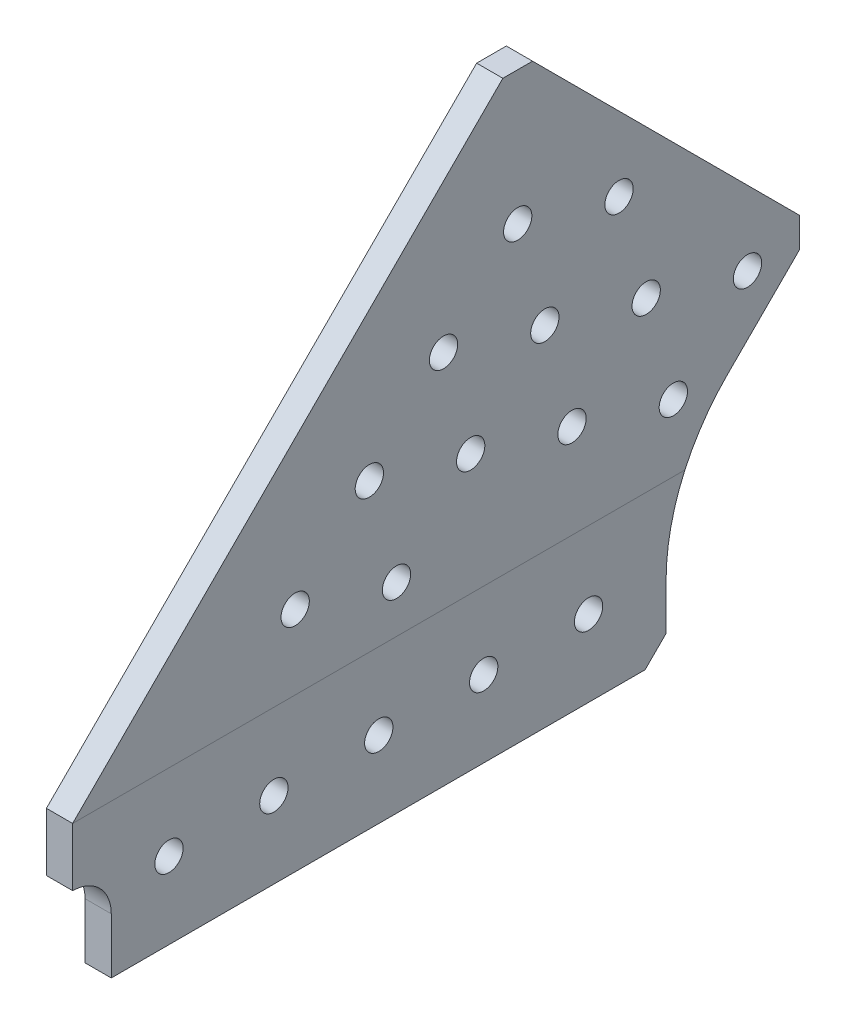
ISO-10303-21;
HEADER;
FILE_DESCRIPTION(('STEP AP214'),'2;1');
FILE_NAME('part.step','',(''),(''),'','','');
FILE_SCHEMA(('AUTOMOTIVE_DESIGN { 1 0 10303 214 1 1 1 1 }'));
ENDSEC;
DATA;
#1=APPLICATION_CONTEXT('core data for automotive mechanical design processes');
#2=APPLICATION_PROTOCOL_DEFINITION('international standard','automotive_design',2000,#1);
#3=PRODUCT_CONTEXT('',#1,'mechanical');
#4=PRODUCT('Part','Part','',(#3));
#5=PRODUCT_RELATED_PRODUCT_CATEGORY('part','',(#4));
#6=PRODUCT_DEFINITION_FORMATION('','',#4);
#7=PRODUCT_DEFINITION_CONTEXT('part definition',#1,'design');
#8=PRODUCT_DEFINITION('design','',#6,#7);
#9=PRODUCT_DEFINITION_SHAPE('','',#8);
#10=(LENGTH_UNIT() NAMED_UNIT(*) SI_UNIT(.MILLI.,.METRE.));
#11=(NAMED_UNIT(*) PLANE_ANGLE_UNIT() SI_UNIT($,.RADIAN.));
#12=(NAMED_UNIT(*) SI_UNIT($,.STERADIAN.) SOLID_ANGLE_UNIT());
#13=UNCERTAINTY_MEASURE_WITH_UNIT(LENGTH_MEASURE(1.E-05),#10,'distance_accuracy_value','');
#14=(GEOMETRIC_REPRESENTATION_CONTEXT(3) GLOBAL_UNCERTAINTY_ASSIGNED_CONTEXT((#13)) GLOBAL_UNIT_ASSIGNED_CONTEXT((#10,
#11,#12)) REPRESENTATION_CONTEXT('',''));
#15=CARTESIAN_POINT('',(0.,0.,0.));
#16=DIRECTION('',(0.,0.,1.));
#17=DIRECTION('',(1.,0.,0.));
#18=AXIS2_PLACEMENT_3D('',#15,#16,#17);
#19=CARTESIAN_POINT('',(3.175,8.02097551572331,-25.4));
#20=DIRECTION('',(1.,0.,0.));
#21=DIRECTION('',(0.,0.,-1.));
#22=AXIS2_PLACEMENT_3D('',#19,#20,#21);
#23=PLANE('',#22);
#24=CARTESIAN_POINT('',(3.175,6.73099999999865,71.9292945685666));
#25=DIRECTION('',(-1.,0.,0.));
#26=DIRECTION('',(0.,0.,1.));
#27=AXIS2_PLACEMENT_3D('',#24,#25,#26);
#28=CIRCLE('',#27,4.7625);
#29=CARTESIAN_POINT('',(3.175,11.492700794387,71.8420489685536));
#30=VERTEX_POINT('',#29);
#31=CARTESIAN_POINT('',(3.175,6.73099999999865,67.1667945685666));
#32=VERTEX_POINT('',#31);
#33=EDGE_CURVE('E173',#30,#32,#28,.T.);
#34=ORIENTED_EDGE('',*,*,#33,.T.);
#35=DIRECTION('',(0.,-1.,0.));
#36=VECTOR('',#35,1.);
#37=CARTESIAN_POINT('',(3.175,6.73099999999865,67.1667945685666));
#38=LINE('',#37,#36);
#39=CARTESIAN_POINT('',(3.175,0.,67.1667945685666));
#40=VERTEX_POINT('',#39);
#41=EDGE_CURVE('E180',#32,#40,#38,.T.);
#42=ORIENTED_EDGE('',*,*,#41,.T.);
#43=DIRECTION('',(0.,0.,-1.));
#44=VECTOR('',#43,1.);
#45=CARTESIAN_POINT('',(3.175,0.,71.8420489685536));
#46=LINE('',#45,#44);
#47=CARTESIAN_POINT('',(3.175,0.,2.54000000000003));
#48=VERTEX_POINT('',#47);
#49=EDGE_CURVE('E344',#40,#48,#46,.T.);
#50=ORIENTED_EDGE('',*,*,#49,.T.);
#51=DIRECTION('',(0.,-0.707106781186546,0.707106781186549));
#52=VECTOR('',#51,1.);
#53=CARTESIAN_POINT('',(3.175,17.9804877578616,-15.4404877578617));
#54=LINE('',#53,#52);
#55=CARTESIAN_POINT('',(3.175,2.54000000000001,0.));
#56=VERTEX_POINT('',#55);
#57=EDGE_CURVE('E419',#48,#56,#54,.F.);
#58=ORIENTED_EDGE('',*,*,#57,.T.);
#59=DIRECTION('',(0.,1.,0.));
#60=VECTOR('',#59,1.);
#61=CARTESIAN_POINT('',(3.175,0.,0.));
#62=LINE('',#61,#60);
#63=CARTESIAN_POINT('',(3.175,8.02097551572331,0.));
#64=VERTEX_POINT('',#63);
#65=EDGE_CURVE('E347',#56,#64,#62,.T.);
#66=ORIENTED_EDGE('',*,*,#65,.T.);
#67=CARTESIAN_POINT('',(3.175,8.02097551572331,-25.4));
#68=DIRECTION('',(-1.,0.,0.));
#69=DIRECTION('',(0.,0.,-1.));
#70=AXIS2_PLACEMENT_3D('',#67,#68,#69);
#71=CIRCLE('',#70,25.4);
#72=CARTESIAN_POINT('',(3.175,18.542,-2.28143508343888));
#73=VERTEX_POINT('',#72);
#74=EDGE_CURVE('E352',#64,#73,#71,.T.);
#75=ORIENTED_EDGE('',*,*,#74,.T.);
#76=DIRECTION('',(0.,0.,1.));
#77=VECTOR('',#76,1.);
#78=CARTESIAN_POINT('',(3.175,18.542,-25.4));
#79=LINE('',#78,#77);
#80=CARTESIAN_POINT('',(3.175,18.542,71.8420489685536));
#81=VERTEX_POINT('',#80);
#82=EDGE_CURVE('E402',#73,#81,#79,.T.);
#83=ORIENTED_EDGE('',*,*,#82,.T.);
#84=DIRECTION('',(0.,-1.,0.));
#85=VECTOR('',#84,1.);
#86=CARTESIAN_POINT('',(3.175,18.542,71.8420489685536));
#87=LINE('',#86,#85);
#88=EDGE_CURVE('E193',#81,#30,#87,.T.);
#89=ORIENTED_EDGE('',*,*,#88,.T.);
#90=EDGE_LOOP('',(#34,#42,#50,#58,#66,#75,#83,#89));
#91=FACE_BOUND('',#90,.T.);
#92=CARTESIAN_POINT('',(3.175,9.271,60.1803069425573));
#93=DIRECTION('',(1.,0.,0.));
#94=DIRECTION('',(0.,1.,0.));
#95=AXIS2_PLACEMENT_3D('',#92,#93,#94);
#96=CIRCLE('',#95,1.7145);
#97=CARTESIAN_POINT('',(3.175,10.9855,60.1803069425573));
#98=VERTEX_POINT('',#97);
#99=EDGE_CURVE('E309',#98,#98,#96,.T.);
#100=ORIENTED_EDGE('',*,*,#99,.F.);
#101=EDGE_LOOP('',(#100));
#102=FACE_BOUND('',#101,.T.);
#103=CARTESIAN_POINT('',(3.175,9.271,47.4803069425573));
#104=DIRECTION('',(1.,0.,0.));
#105=DIRECTION('',(0.,1.,0.));
#106=AXIS2_PLACEMENT_3D('',#103,#104,#105);
#107=CIRCLE('',#106,1.7145);
#108=CARTESIAN_POINT('',(3.175,10.9855,47.4803069425573));
#109=VERTEX_POINT('',#108);
#110=EDGE_CURVE('E317',#109,#109,#107,.T.);
#111=ORIENTED_EDGE('',*,*,#110,.F.);
#112=EDGE_LOOP('',(#111));
#113=FACE_BOUND('',#112,.T.);
#114=CARTESIAN_POINT('',(3.175,9.271,34.7803069425574));
#115=DIRECTION('',(1.,0.,0.));
#116=DIRECTION('',(0.,1.,0.));
#117=AXIS2_PLACEMENT_3D('',#114,#115,#116);
#118=CIRCLE('',#117,1.7145);
#119=CARTESIAN_POINT('',(3.175,10.9855,34.7803069425574));
#120=VERTEX_POINT('',#119);
#121=EDGE_CURVE('E325',#120,#120,#118,.T.);
#122=ORIENTED_EDGE('',*,*,#121,.F.);
#123=EDGE_LOOP('',(#122));
#124=FACE_BOUND('',#123,.T.);
#125=CARTESIAN_POINT('',(3.175,9.271,22.0803069425574));
#126=DIRECTION('',(1.,0.,0.));
#127=DIRECTION('',(0.,1.,0.));
#128=AXIS2_PLACEMENT_3D('',#125,#126,#127);
#129=CIRCLE('',#128,1.7145);
#130=CARTESIAN_POINT('',(3.175,10.9855,22.0803069425574));
#131=VERTEX_POINT('',#130);
#132=EDGE_CURVE('E333',#131,#131,#129,.T.);
#133=ORIENTED_EDGE('',*,*,#132,.F.);
#134=EDGE_LOOP('',(#133));
#135=FACE_BOUND('',#134,.T.);
#136=CARTESIAN_POINT('',(3.175,9.271,9.38030694255748));
#137=DIRECTION('',(1.,0.,0.));
#138=DIRECTION('',(0.,1.,0.));
#139=AXIS2_PLACEMENT_3D('',#136,#137,#138);
#140=CIRCLE('',#139,1.7145);
#141=CARTESIAN_POINT('',(3.175,10.9855,9.38030694255748));
#142=VERTEX_POINT('',#141);
#143=EDGE_CURVE('E212',#142,#142,#140,.T.);
#144=ORIENTED_EDGE('',*,*,#143,.F.);
#145=EDGE_LOOP('',(#144));
#146=FACE_BOUND('',#145,.T.);
#147=ADVANCED_FACE('F53',(#91,#102,#113,#124,#135,#146),#23,.T.);
#148=CARTESIAN_POINT('',(3.175,0.,71.8420489685536));
#149=DIRECTION('',(0.,1.,0.));
#150=DIRECTION('',(0.,0.,1.));
#151=AXIS2_PLACEMENT_3D('',#148,#149,#150);
#152=PLANE('',#151);
#153=ORIENTED_EDGE('',*,*,#49,.F.);
#154=DIRECTION('',(-1.,0.,0.));
#155=VECTOR('',#154,1.);
#156=CARTESIAN_POINT('',(3.175,0.,67.1667945685666));
#157=LINE('',#156,#155);
#158=CARTESIAN_POINT('',(0.,0.,67.1667945685666));
#159=VERTEX_POINT('',#158);
#160=EDGE_CURVE('E179',#40,#159,#157,.T.);
#161=ORIENTED_EDGE('',*,*,#160,.T.);
#162=DIRECTION('',(0.,0.,-1.));
#163=VECTOR('',#162,1.);
#164=CARTESIAN_POINT('',(0.,0.,71.8420489685536));
#165=LINE('',#164,#163);
#166=CARTESIAN_POINT('',(0.,0.,2.54000000000003));
#167=VERTEX_POINT('',#166);
#168=EDGE_CURVE('E308',#159,#167,#165,.T.);
#169=ORIENTED_EDGE('',*,*,#168,.T.);
#170=DIRECTION('',(1.,0.,0.));
#171=VECTOR('',#170,1.);
#172=CARTESIAN_POINT('',(3.175,0.,2.54000000000003));
#173=LINE('',#172,#171);
#174=EDGE_CURVE('E405',#167,#48,#173,.T.);
#175=ORIENTED_EDGE('',*,*,#174,.T.);
#176=EDGE_LOOP('',(#153,#161,#169,#175));
#177=FACE_BOUND('',#176,.T.);
#178=ADVANCED_FACE('F473',(#177),#152,.F.);
#179=CARTESIAN_POINT('',(3.175,0.,0.));
#180=DIRECTION('',(0.,0.,1.));
#181=DIRECTION('',(1.,0.,0.));
#182=AXIS2_PLACEMENT_3D('',#179,#180,#181);
#183=PLANE('',#182);
#184=ORIENTED_EDGE('',*,*,#65,.F.);
#185=DIRECTION('',(-1.,0.,0.));
#186=VECTOR('',#185,1.);
#187=CARTESIAN_POINT('',(3.175,2.54000000000001,0.));
#188=LINE('',#187,#186);
#189=CARTESIAN_POINT('',(0.,2.54000000000001,0.));
#190=VERTEX_POINT('',#189);
#191=EDGE_CURVE('E422',#56,#190,#188,.T.);
#192=ORIENTED_EDGE('',*,*,#191,.T.);
#193=DIRECTION('',(0.,1.,0.));
#194=VECTOR('',#193,1.);
#195=CARTESIAN_POINT('',(0.,0.,0.));
#196=LINE('',#195,#194);
#197=CARTESIAN_POINT('',(0.,8.02097551572331,0.));
#198=VERTEX_POINT('',#197);
#199=EDGE_CURVE('E371',#190,#198,#196,.T.);
#200=ORIENTED_EDGE('',*,*,#199,.T.);
#201=DIRECTION('',(-1.,0.,0.));
#202=VECTOR('',#201,1.);
#203=CARTESIAN_POINT('',(3.175,8.02097551572331,0.));
#204=LINE('',#203,#202);
#205=EDGE_CURVE('E398',#64,#198,#204,.T.);
#206=ORIENTED_EDGE('',*,*,#205,.F.);
#207=EDGE_LOOP('',(#184,#192,#200,#206));
#208=FACE_BOUND('',#207,.T.);
#209=ADVANCED_FACE('F467',(#208),#183,.F.);
#210=CARTESIAN_POINT('',(3.175,8.02097551572331,-25.4));
#211=DIRECTION('',(-1.,0.,0.));
#212=DIRECTION('',(0.,0.,1.));
#213=AXIS2_PLACEMENT_3D('',#210,#211,#212);
#214=CYLINDRICAL_SURFACE('',#213,25.4);
#215=CARTESIAN_POINT('',(0.,8.02097551572331,-25.4));
#216=DIRECTION('',(-1.,0.,0.));
#217=DIRECTION('',(0.,0.,-1.));
#218=AXIS2_PLACEMENT_3D('',#215,#216,#217);
#219=CIRCLE('',#218,25.4);
#220=CARTESIAN_POINT('',(0.,25.9814877578617,-7.43948775786178));
#221=VERTEX_POINT('',#220);
#222=EDGE_CURVE('E374',#198,#221,#219,.T.);
#223=ORIENTED_EDGE('',*,*,#222,.T.);
#224=DIRECTION('',(-1.,0.,0.));
#225=VECTOR('',#224,1.);
#226=CARTESIAN_POINT('',(3.175,25.9814877578617,-7.43948775786178));
#227=LINE('',#226,#225);
#228=CARTESIAN_POINT('',(3.175,25.9814877578617,-7.43948775786178));
#229=VERTEX_POINT('',#228);
#230=EDGE_CURVE('E394',#229,#221,#227,.T.);
#231=ORIENTED_EDGE('',*,*,#230,.F.);
#232=EDGE_CURVE('E351',#73,#229,#71,.T.);
#233=ORIENTED_EDGE('',*,*,#232,.F.);
#234=ORIENTED_EDGE('',*,*,#74,.F.);
#235=ORIENTED_EDGE('',*,*,#205,.T.);
#236=EDGE_LOOP('',(#223,#231,#233,#234,#235));
#237=FACE_BOUND('',#236,.T.);
#238=ADVANCED_FACE('F459',(#237),#214,.F.);
#239=CARTESIAN_POINT('',(3.175,25.9814877578617,-7.43948775786178));
#240=DIRECTION('',(0.,0.707106781186551,0.707106781186544));
#241=DIRECTION('',(0.,-0.707106781186544,0.707106781186551));
#242=AXIS2_PLACEMENT_3D('',#239,#240,#241);
#243=PLANE('',#242);
#244=DIRECTION('',(0.,0.707106781186544,-0.707106781186551));
#245=VECTOR('',#244,1.);
#246=CARTESIAN_POINT('',(0.,25.9814877578617,-7.43948775786178));
#247=LINE('',#246,#245);
#248=CARTESIAN_POINT('',(0.,34.7064610179244,-16.1644610179246));
#249=VERTEX_POINT('',#248);
#250=EDGE_CURVE('E377',#221,#249,#247,.T.);
#251=ORIENTED_EDGE('',*,*,#250,.T.);
#252=DIRECTION('',(1.,0.,0.));
#253=VECTOR('',#252,1.);
#254=CARTESIAN_POINT('',(3.175,34.7064610179244,-16.1644610179246));
#255=LINE('',#254,#253);
#256=CARTESIAN_POINT('',(3.175,34.7064610179244,-16.1644610179246));
#257=VERTEX_POINT('',#256);
#258=EDGE_CURVE('E433',#249,#257,#255,.T.);
#259=ORIENTED_EDGE('',*,*,#258,.T.);
#260=DIRECTION('',(0.,0.707106781186544,-0.707106781186551));
#261=VECTOR('',#260,1.);
#262=CARTESIAN_POINT('',(3.175,25.9814877578617,-7.43948775786178));
#263=LINE('',#262,#261);
#264=EDGE_CURVE('E356',#229,#257,#263,.T.);
#265=ORIENTED_EDGE('',*,*,#264,.F.);
#266=ORIENTED_EDGE('',*,*,#230,.T.);
#267=EDGE_LOOP('',(#251,#259,#265,#266));
#268=FACE_BOUND('',#267,.T.);
#269=ADVANCED_FACE('F455',(#268),#243,.F.);
#270=CARTESIAN_POINT('',(3.175,72.423536726415,17.960512242138));
#271=DIRECTION('',(0.,-0.707106781186544,0.707106781186551));
#272=DIRECTION('',(0.,-0.707106781186551,-0.707106781186544));
#273=AXIS2_PLACEMENT_3D('',#270,#271,#272);
#274=PLANE('',#273);
#275=DIRECTION('',(0.,0.707106781186551,0.707106781186544));
#276=VECTOR('',#275,1.);
#277=CARTESIAN_POINT('',(3.175,72.423536726415,17.960512242138));
#278=LINE('',#277,#276);
#279=CARTESIAN_POINT('',(3.175,38.2985634663521,-16.1644610179246));
#280=VERTEX_POINT('',#279);
#281=CARTESIAN_POINT('',(3.175,70.6274855022012,16.1644610179242));
#282=VERTEX_POINT('',#281);
#283=EDGE_CURVE('E360',#280,#282,#278,.T.);
#284=ORIENTED_EDGE('',*,*,#283,.F.);
#285=DIRECTION('',(-1.,0.,0.));
#286=VECTOR('',#285,1.);
#287=CARTESIAN_POINT('',(3.175,38.2985634663521,-16.1644610179246));
#288=LINE('',#287,#286);
#289=CARTESIAN_POINT('',(0.,38.2985634663521,-16.1644610179246));
#290=VERTEX_POINT('',#289);
#291=EDGE_CURVE('E429',#280,#290,#288,.T.);
#292=ORIENTED_EDGE('',*,*,#291,.T.);
#293=DIRECTION('',(0.,0.707106781186551,0.707106781186544));
#294=VECTOR('',#293,1.);
#295=CARTESIAN_POINT('',(0.,72.423536726415,17.960512242138));
#296=LINE('',#295,#294);
#297=CARTESIAN_POINT('',(0.,70.6274855022012,16.1644610179242));
#298=VERTEX_POINT('',#297);
#299=EDGE_CURVE('E381',#290,#298,#296,.T.);
#300=ORIENTED_EDGE('',*,*,#299,.T.);
#301=DIRECTION('',(1.,0.,0.));
#302=VECTOR('',#301,1.);
#303=CARTESIAN_POINT('',(3.175,70.6274855022012,16.1644610179242));
#304=LINE('',#303,#302);
#305=EDGE_CURVE('E426',#298,#282,#304,.T.);
#306=ORIENTED_EDGE('',*,*,#305,.T.);
#307=EDGE_LOOP('',(#284,#292,#300,#306));
#308=FACE_BOUND('',#307,.T.);
#309=ADVANCED_FACE('F446',(#308),#274,.F.);
#310=CARTESIAN_POINT('',(3.175,72.423536726415,17.960512242138));
#311=DIRECTION('',(0.,-0.707106781186551,-0.707106781186544));
#312=DIRECTION('',(0.,0.707106781186544,-0.707106781186551));
#313=AXIS2_PLACEMENT_3D('',#310,#311,#312);
#314=PLANE('',#313);
#315=DIRECTION('',(0.,-0.707106781186544,0.707106781186551));
#316=VECTOR('',#315,1.);
#317=CARTESIAN_POINT('',(3.175,72.423536726415,17.960512242138));
#318=LINE('',#317,#316);
#319=CARTESIAN_POINT('',(3.175,70.6274855022012,19.7565634663519));
#320=VERTEX_POINT('',#319);
#321=EDGE_CURVE('E363',#320,#81,#318,.T.);
#322=ORIENTED_EDGE('',*,*,#321,.F.);
#323=DIRECTION('',(-1.,0.,0.));
#324=VECTOR('',#323,1.);
#325=CARTESIAN_POINT('',(3.175,70.6274855022012,19.7565634663519));
#326=LINE('',#325,#324);
#327=CARTESIAN_POINT('',(0.,70.6274855022012,19.7565634663519));
#328=VERTEX_POINT('',#327);
#329=EDGE_CURVE('E12',#320,#328,#326,.T.);
#330=ORIENTED_EDGE('',*,*,#329,.T.);
#331=DIRECTION('',(0.,-0.707106781186544,0.707106781186551));
#332=VECTOR('',#331,1.);
#333=CARTESIAN_POINT('',(0.,72.423536726415,17.960512242138));
#334=LINE('',#333,#332);
#335=CARTESIAN_POINT('',(0.,18.542,71.8420489685536));
#336=VERTEX_POINT('',#335);
#337=EDGE_CURVE('E385',#328,#336,#334,.T.);
#338=ORIENTED_EDGE('',*,*,#337,.T.);
#339=DIRECTION('',(-1.,0.,0.));
#340=VECTOR('',#339,1.);
#341=CARTESIAN_POINT('',(3.175,18.542,71.8420489685536));
#342=LINE('',#341,#340);
#343=EDGE_CURVE('E368',#81,#336,#342,.T.);
#344=ORIENTED_EDGE('',*,*,#343,.F.);
#345=EDGE_LOOP('',(#322,#330,#338,#344));
#346=FACE_BOUND('',#345,.T.);
#347=ADVANCED_FACE('F480',(#346),#314,.F.);
#348=CARTESIAN_POINT('',(3.175,18.542,71.8420489685536));
#349=DIRECTION('',(0.,0.,-1.));
#350=DIRECTION('',(0.,1.,0.));
#351=AXIS2_PLACEMENT_3D('',#348,#349,#350);
#352=PLANE('',#351);
#353=DIRECTION('',(0.,-1.,0.));
#354=VECTOR('',#353,1.);
#355=CARTESIAN_POINT('',(0.,18.542,71.8420489685536));
#356=LINE('',#355,#354);
#357=CARTESIAN_POINT('',(0.,11.492700794387,71.8420489685536));
#358=VERTEX_POINT('',#357);
#359=EDGE_CURVE('E348',#336,#358,#356,.T.);
#360=ORIENTED_EDGE('',*,*,#359,.T.);
#361=DIRECTION('',(-1.,0.,0.));
#362=VECTOR('',#361,1.);
#363=CARTESIAN_POINT('',(3.175,11.492700794387,71.8420489685536));
#364=LINE('',#363,#362);
#365=EDGE_CURVE('E203',#358,#30,#364,.F.);
#366=ORIENTED_EDGE('',*,*,#365,.T.);
#367=ORIENTED_EDGE('',*,*,#88,.F.);
#368=ORIENTED_EDGE('',*,*,#343,.T.);
#369=EDGE_LOOP('',(#360,#366,#367,#368));
#370=FACE_BOUND('',#369,.T.);
#371=ADVANCED_FACE('F477',(#370),#352,.F.);
#372=CARTESIAN_POINT('',(3.175,27.5222561210694,44.901280605346));
#373=DIRECTION('',(1.,0.,0.));
#374=DIRECTION('',(0.,1.,0.));
#375=AXIS2_PLACEMENT_3D('',#372,#373,#374);
#376=CIRCLE('',#375,1.7145);
#377=CARTESIAN_POINT('',(3.175,29.2367561210694,44.901280605346));
#378=VERTEX_POINT('',#377);
#379=EDGE_CURVE('E213',#378,#378,#376,.T.);
#380=ORIENTED_EDGE('',*,*,#379,.F.);
#381=EDGE_LOOP('',(#380));
#382=FACE_BOUND('',#381,.T.);
#383=CARTESIAN_POINT('',(3.175,38.9087646176033,2.40625237546535));
#384=DIRECTION('',(1.,0.,0.));
#385=DIRECTION('',(0.,1.,0.));
#386=AXIS2_PLACEMENT_3D('',#383,#384,#385);
#387=CIRCLE('',#386,1.7145);
#388=CARTESIAN_POINT('',(3.175,40.6232646176033,2.40625237546535));
#389=VERTEX_POINT('',#388);
#390=EDGE_CURVE('E231',#389,#389,#387,.T.);
#391=ORIENTED_EDGE('',*,*,#390,.F.);
#392=EDGE_LOOP('',(#391));
#393=FACE_BOUND('',#392,.T.);
#394=CARTESIAN_POINT('',(3.175,54.4630244842766,17.9605122421385));
#395=DIRECTION('',(1.,0.,0.));
#396=DIRECTION('',(0.,1.,0.));
#397=AXIS2_PLACEMENT_3D('',#394,#395,#396);
#398=CIRCLE('',#397,1.7145);
#399=CARTESIAN_POINT('',(3.175,56.1775244842766,17.9605122421385));
#400=VERTEX_POINT('',#399);
#401=EDGE_CURVE('E222',#400,#400,#398,.T.);
#402=ORIENTED_EDGE('',*,*,#401,.F.);
#403=EDGE_LOOP('',(#402));
#404=FACE_BOUND('',#403,.T.);
#405=CARTESIAN_POINT('',(3.175,51.1760226114745,5.69325424826733));
#406=DIRECTION('',(1.,0.,0.));
#407=DIRECTION('',(0.,1.,0.));
#408=AXIS2_PLACEMENT_3D('',#405,#406,#407);
#409=CIRCLE('',#408,1.7145);
#410=CARTESIAN_POINT('',(3.175,52.8905226114745,5.69325424826733));
#411=VERTEX_POINT('',#410);
#412=EDGE_CURVE('E207',#411,#411,#409,.T.);
#413=ORIENTED_EDGE('',*,*,#412,.F.);
#414=EDGE_LOOP('',(#413));
#415=FACE_BOUND('',#414,.T.);
#416=CARTESIAN_POINT('',(3.175,24.2352542482673,32.6340226114748));
#417=DIRECTION('',(1.,0.,0.));
#418=DIRECTION('',(0.,1.,0.));
#419=AXIS2_PLACEMENT_3D('',#416,#417,#418);
#420=CIRCLE('',#419,1.7145);
#421=CARTESIAN_POINT('',(3.175,25.9497542482673,32.6340226114748));
#422=VERTEX_POINT('',#421);
#423=EDGE_CURVE('E277',#422,#422,#420,.T.);
#424=ORIENTED_EDGE('',*,*,#423,.F.);
#425=EDGE_LOOP('',(#424));
#426=FACE_BOUND('',#425,.T.);
#427=CARTESIAN_POINT('',(3.175,33.2155103693363,23.6537664904057));
#428=DIRECTION('',(1.,0.,0.));
#429=DIRECTION('',(0.,1.,0.));
#430=AXIS2_PLACEMENT_3D('',#427,#428,#429);
#431=CIRCLE('',#430,1.7145);
#432=CARTESIAN_POINT('',(3.175,34.9300103693363,23.6537664904057));
#433=VERTEX_POINT('',#432);
#434=EDGE_CURVE('E285',#433,#433,#431,.T.);
#435=ORIENTED_EDGE('',*,*,#434,.F.);
#436=EDGE_LOOP('',(#435));
#437=FACE_BOUND('',#436,.T.);
#438=CARTESIAN_POINT('',(3.175,29.9285084965342,11.3865084965345));
#439=DIRECTION('',(1.,0.,0.));
#440=DIRECTION('',(0.,1.,0.));
#441=AXIS2_PLACEMENT_3D('',#438,#439,#440);
#442=CIRCLE('',#441,1.7145);
#443=CARTESIAN_POINT('',(3.175,31.6430084965342,11.3865084965345));
#444=VERTEX_POINT('',#443);
#445=EDGE_CURVE('E293',#444,#444,#442,.T.);
#446=ORIENTED_EDGE('',*,*,#445,.F.);
#447=EDGE_LOOP('',(#446));
#448=FACE_BOUND('',#447,.T.);
#449=CARTESIAN_POINT('',(3.175,26.6415066237321,-0.88074949733663));
#450=DIRECTION('',(1.,0.,0.));
#451=DIRECTION('',(0.,1.,0.));
#452=AXIS2_PLACEMENT_3D('',#449,#450,#451);
#453=CIRCLE('',#452,1.7145);
#454=CARTESIAN_POINT('',(3.175,28.3560066237321,-0.88074949733663));
#455=VERTEX_POINT('',#454);
#456=EDGE_CURVE('E246',#455,#455,#453,.T.);
#457=ORIENTED_EDGE('',*,*,#456,.F.);
#458=EDGE_LOOP('',(#457));
#459=FACE_BOUND('',#458,.T.);
#460=CARTESIAN_POINT('',(3.175,35.6217627448012,-9.86100561840579));
#461=DIRECTION('',(1.,0.,0.));
#462=DIRECTION('',(0.,1.,0.));
#463=AXIS2_PLACEMENT_3D('',#460,#461,#462);
#464=CIRCLE('',#463,1.7145);
#465=CARTESIAN_POINT('',(3.175,37.3362627448012,-9.86100561840579));
#466=VERTEX_POINT('',#465);
#467=EDGE_CURVE('E247',#466,#466,#464,.T.);
#468=ORIENTED_EDGE('',*,*,#467,.F.);
#469=EDGE_LOOP('',(#468));
#470=FACE_BOUND('',#469,.T.);
#471=CARTESIAN_POINT('',(3.175,36.5025122421384,35.9210244842768));
#472=DIRECTION('',(1.,0.,0.));
#473=DIRECTION('',(0.,1.,0.));
#474=AXIS2_PLACEMENT_3D('',#471,#472,#473);
#475=CIRCLE('',#474,1.7145);
#476=CARTESIAN_POINT('',(3.175,38.2170122421384,35.9210244842768));
#477=VERTEX_POINT('',#476);
#478=EDGE_CURVE('E255',#477,#477,#475,.T.);
#479=ORIENTED_EDGE('',*,*,#478,.F.);
#480=EDGE_LOOP('',(#479));
#481=FACE_BOUND('',#480,.T.);
#482=CARTESIAN_POINT('',(3.175,45.4827683632075,26.9407683632076));
#483=DIRECTION('',(1.,0.,0.));
#484=DIRECTION('',(0.,1.,0.));
#485=AXIS2_PLACEMENT_3D('',#482,#483,#484);
#486=CIRCLE('',#485,1.7145);
#487=CARTESIAN_POINT('',(3.175,47.1972683632075,26.9407683632076));
#488=VERTEX_POINT('',#487);
#489=EDGE_CURVE('E263',#488,#488,#486,.T.);
#490=ORIENTED_EDGE('',*,*,#489,.F.);
#491=EDGE_LOOP('',(#490));
#492=FACE_BOUND('',#491,.T.);
#493=CARTESIAN_POINT('',(3.175,42.1957664904054,14.6735103693365));
#494=DIRECTION('',(1.,0.,0.));
#495=DIRECTION('',(0.,1.,0.));
#496=AXIS2_PLACEMENT_3D('',#493,#494,#495);
#497=CIRCLE('',#496,1.7145);
#498=CARTESIAN_POINT('',(3.175,43.9102664904054,14.6735103693365));
#499=VERTEX_POINT('',#498);
#500=EDGE_CURVE('E230',#499,#499,#497,.T.);
#501=ORIENTED_EDGE('',*,*,#500,.F.);
#502=EDGE_LOOP('',(#501));
#503=FACE_BOUND('',#502,.T.);
#504=ORIENTED_EDGE('',*,*,#264,.T.);
#505=DIRECTION('',(0.,-1.,0.));
#506=VECTOR('',#505,1.);
#507=CARTESIAN_POINT('',(3.175,8.02097551572338,-16.1644610179244));
#508=LINE('',#507,#506);
#509=EDGE_CURVE('E63',#257,#280,#508,.F.);
#510=ORIENTED_EDGE('',*,*,#509,.T.);
#511=ORIENTED_EDGE('',*,*,#283,.T.);
#512=DIRECTION('',(0.,0.,-1.));
#513=VECTOR('',#512,1.);
#514=CARTESIAN_POINT('',(3.175,70.6274855022009,-25.4000000000005));
#515=LINE('',#514,#513);
#516=EDGE_CURVE('E83',#282,#320,#515,.F.);
#517=ORIENTED_EDGE('',*,*,#516,.T.);
#518=ORIENTED_EDGE('',*,*,#321,.T.);
#519=ORIENTED_EDGE('',*,*,#82,.F.);
#520=ORIENTED_EDGE('',*,*,#232,.T.);
#521=EDGE_LOOP('',(#504,#510,#511,#517,#518,#519,#520));
#522=FACE_BOUND('',#521,.T.);
#523=ADVANCED_FACE('F440',(#382,#393,#404,#415,#426,#437,#448,#459,#470,#481,#492,#503,#522),
#23,.T.);
#524=CARTESIAN_POINT('',(0.,8.02097551572331,-25.4));
#525=DIRECTION('',(1.,0.,0.));
#526=DIRECTION('',(0.,0.,-1.));
#527=AXIS2_PLACEMENT_3D('',#524,#525,#526);
#528=PLANE('',#527);
#529=CARTESIAN_POINT('',(0.,27.5222561210694,44.901280605346));
#530=DIRECTION('',(1.,0.,0.));
#531=DIRECTION('',(0.,1.,0.));
#532=AXIS2_PLACEMENT_3D('',#529,#530,#531);
#533=CIRCLE('',#532,1.7145);
#534=CARTESIAN_POINT('',(0.,29.2367561210694,44.901280605346));
#535=VERTEX_POINT('',#534);
#536=EDGE_CURVE('E208',#535,#535,#533,.T.);
#537=ORIENTED_EDGE('',*,*,#536,.T.);
#538=EDGE_LOOP('',(#537));
#539=FACE_BOUND('',#538,.T.);
#540=CARTESIAN_POINT('',(0.,38.9087646176033,2.40625237546535));
#541=DIRECTION('',(1.,0.,0.));
#542=DIRECTION('',(0.,1.,0.));
#543=AXIS2_PLACEMENT_3D('',#540,#541,#542);
#544=CIRCLE('',#543,1.7145);
#545=CARTESIAN_POINT('',(0.,40.6232646176033,2.40625237546535));
#546=VERTEX_POINT('',#545);
#547=EDGE_CURVE('E226',#546,#546,#544,.T.);
#548=ORIENTED_EDGE('',*,*,#547,.T.);
#549=EDGE_LOOP('',(#548));
#550=FACE_BOUND('',#549,.T.);
#551=CARTESIAN_POINT('',(0.,54.4630244842766,17.9605122421385));
#552=DIRECTION('',(1.,0.,0.));
#553=DIRECTION('',(0.,1.,0.));
#554=AXIS2_PLACEMENT_3D('',#551,#552,#553);
#555=CIRCLE('',#554,1.7145);
#556=CARTESIAN_POINT('',(0.,56.1775244842766,17.9605122421385));
#557=VERTEX_POINT('',#556);
#558=EDGE_CURVE('E235',#557,#557,#555,.T.);
#559=ORIENTED_EDGE('',*,*,#558,.T.);
#560=EDGE_LOOP('',(#559));
#561=FACE_BOUND('',#560,.T.);
#562=CARTESIAN_POINT('',(0.,51.1760226114745,5.69325424826733));
#563=DIRECTION('',(1.,0.,0.));
#564=DIRECTION('',(0.,1.,0.));
#565=AXIS2_PLACEMENT_3D('',#562,#563,#564);
#566=CIRCLE('',#565,1.7145);
#567=CARTESIAN_POINT('',(0.,52.8905226114745,5.69325424826733));
#568=VERTEX_POINT('',#567);
#569=EDGE_CURVE('E218',#568,#568,#566,.T.);
#570=ORIENTED_EDGE('',*,*,#569,.T.);
#571=EDGE_LOOP('',(#570));
#572=FACE_BOUND('',#571,.T.);
#573=CARTESIAN_POINT('',(0.,24.2352542482673,32.6340226114748));
#574=DIRECTION('',(1.,0.,0.));
#575=DIRECTION('',(0.,1.,0.));
#576=AXIS2_PLACEMENT_3D('',#573,#574,#575);
#577=CIRCLE('',#576,1.7145);
#578=CARTESIAN_POINT('',(0.,25.9497542482673,32.6340226114748));
#579=VERTEX_POINT('',#578);
#580=EDGE_CURVE('E217',#579,#579,#577,.T.);
#581=ORIENTED_EDGE('',*,*,#580,.T.);
#582=EDGE_LOOP('',(#581));
#583=FACE_BOUND('',#582,.T.);
#584=CARTESIAN_POINT('',(0.,33.2155103693363,23.6537664904057));
#585=DIRECTION('',(1.,0.,0.));
#586=DIRECTION('',(0.,1.,0.));
#587=AXIS2_PLACEMENT_3D('',#584,#585,#586);
#588=CIRCLE('',#587,1.7145);
#589=CARTESIAN_POINT('',(0.,34.9300103693363,23.6537664904057));
#590=VERTEX_POINT('',#589);
#591=EDGE_CURVE('E281',#590,#590,#588,.T.);
#592=ORIENTED_EDGE('',*,*,#591,.T.);
#593=EDGE_LOOP('',(#592));
#594=FACE_BOUND('',#593,.T.);
#595=CARTESIAN_POINT('',(0.,29.9285084965342,11.3865084965345));
#596=DIRECTION('',(1.,0.,0.));
#597=DIRECTION('',(0.,1.,0.));
#598=AXIS2_PLACEMENT_3D('',#595,#596,#597);
#599=CIRCLE('',#598,1.7145);
#600=CARTESIAN_POINT('',(0.,31.6430084965342,11.3865084965345));
#601=VERTEX_POINT('',#600);
#602=EDGE_CURVE('E289',#601,#601,#599,.T.);
#603=ORIENTED_EDGE('',*,*,#602,.T.);
#604=EDGE_LOOP('',(#603));
#605=FACE_BOUND('',#604,.T.);
#606=CARTESIAN_POINT('',(0.,26.6415066237321,-0.88074949733663));
#607=DIRECTION('',(1.,0.,0.));
#608=DIRECTION('',(0.,1.,0.));
#609=AXIS2_PLACEMENT_3D('',#606,#607,#608);
#610=CIRCLE('',#609,1.7145);
#611=CARTESIAN_POINT('',(0.,28.3560066237321,-0.88074949733663));
#612=VERTEX_POINT('',#611);
#613=EDGE_CURVE('E297',#612,#612,#610,.T.);
#614=ORIENTED_EDGE('',*,*,#613,.T.);
#615=EDGE_LOOP('',(#614));
#616=FACE_BOUND('',#615,.T.);
#617=CARTESIAN_POINT('',(0.,35.6217627448012,-9.86100561840579));
#618=DIRECTION('',(1.,0.,0.));
#619=DIRECTION('',(0.,1.,0.));
#620=AXIS2_PLACEMENT_3D('',#617,#618,#619);
#621=CIRCLE('',#620,1.7145);
#622=CARTESIAN_POINT('',(0.,37.3362627448012,-9.86100561840579));
#623=VERTEX_POINT('',#622);
#624=EDGE_CURVE('E242',#623,#623,#621,.T.);
#625=ORIENTED_EDGE('',*,*,#624,.T.);
#626=EDGE_LOOP('',(#625));
#627=FACE_BOUND('',#626,.T.);
#628=CARTESIAN_POINT('',(0.,36.5025122421384,35.9210244842768));
#629=DIRECTION('',(1.,0.,0.));
#630=DIRECTION('',(0.,1.,0.));
#631=AXIS2_PLACEMENT_3D('',#628,#629,#630);
#632=CIRCLE('',#631,1.7145);
#633=CARTESIAN_POINT('',(0.,38.2170122421384,35.9210244842768));
#634=VERTEX_POINT('',#633);
#635=EDGE_CURVE('E251',#634,#634,#632,.T.);
#636=ORIENTED_EDGE('',*,*,#635,.T.);
#637=EDGE_LOOP('',(#636));
#638=FACE_BOUND('',#637,.T.);
#639=CARTESIAN_POINT('',(0.,45.4827683632075,26.9407683632076));
#640=DIRECTION('',(1.,0.,0.));
#641=DIRECTION('',(0.,1.,0.));
#642=AXIS2_PLACEMENT_3D('',#639,#640,#641);
#643=CIRCLE('',#642,1.7145);
#644=CARTESIAN_POINT('',(0.,47.1972683632075,26.9407683632076));
#645=VERTEX_POINT('',#644);
#646=EDGE_CURVE('E259',#645,#645,#643,.T.);
#647=ORIENTED_EDGE('',*,*,#646,.T.);
#648=EDGE_LOOP('',(#647));
#649=FACE_BOUND('',#648,.T.);
#650=CARTESIAN_POINT('',(0.,42.1957664904054,14.6735103693365));
#651=DIRECTION('',(1.,0.,0.));
#652=DIRECTION('',(0.,1.,0.));
#653=AXIS2_PLACEMENT_3D('',#650,#651,#652);
#654=CIRCLE('',#653,1.7145);
#655=CARTESIAN_POINT('',(0.,43.9102664904054,14.6735103693365));
#656=VERTEX_POINT('',#655);
#657=EDGE_CURVE('E267',#656,#656,#654,.T.);
#658=ORIENTED_EDGE('',*,*,#657,.T.);
#659=EDGE_LOOP('',(#658));
#660=FACE_BOUND('',#659,.T.);
#661=CARTESIAN_POINT('',(0.,9.271,60.1803069425573));
#662=DIRECTION('',(1.,0.,0.));
#663=DIRECTION('',(0.,1.,0.));
#664=AXIS2_PLACEMENT_3D('',#661,#662,#663);
#665=CIRCLE('',#664,1.7145);
#666=CARTESIAN_POINT('',(0.,10.9855,60.1803069425573));
#667=VERTEX_POINT('',#666);
#668=EDGE_CURVE('E304',#667,#667,#665,.T.);
#669=ORIENTED_EDGE('',*,*,#668,.T.);
#670=EDGE_LOOP('',(#669));
#671=FACE_BOUND('',#670,.T.);
#672=CARTESIAN_POINT('',(0.,9.271,47.4803069425573));
#673=DIRECTION('',(1.,0.,0.));
#674=DIRECTION('',(0.,1.,0.));
#675=AXIS2_PLACEMENT_3D('',#672,#673,#674);
#676=CIRCLE('',#675,1.7145);
#677=CARTESIAN_POINT('',(0.,10.9855,47.4803069425573));
#678=VERTEX_POINT('',#677);
#679=EDGE_CURVE('E313',#678,#678,#676,.T.);
#680=ORIENTED_EDGE('',*,*,#679,.T.);
#681=EDGE_LOOP('',(#680));
#682=FACE_BOUND('',#681,.T.);
#683=CARTESIAN_POINT('',(0.,9.271,34.7803069425574));
#684=DIRECTION('',(1.,0.,0.));
#685=DIRECTION('',(0.,1.,0.));
#686=AXIS2_PLACEMENT_3D('',#683,#684,#685);
#687=CIRCLE('',#686,1.7145);
#688=CARTESIAN_POINT('',(0.,10.9855,34.7803069425574));
#689=VERTEX_POINT('',#688);
#690=EDGE_CURVE('E321',#689,#689,#687,.T.);
#691=ORIENTED_EDGE('',*,*,#690,.T.);
#692=EDGE_LOOP('',(#691));
#693=FACE_BOUND('',#692,.T.);
#694=CARTESIAN_POINT('',(0.,9.271,22.0803069425574));
#695=DIRECTION('',(1.,0.,0.));
#696=DIRECTION('',(0.,1.,0.));
#697=AXIS2_PLACEMENT_3D('',#694,#695,#696);
#698=CIRCLE('',#697,1.7145);
#699=CARTESIAN_POINT('',(0.,10.9855,22.0803069425574));
#700=VERTEX_POINT('',#699);
#701=EDGE_CURVE('E329',#700,#700,#698,.T.);
#702=ORIENTED_EDGE('',*,*,#701,.T.);
#703=EDGE_LOOP('',(#702));
#704=FACE_BOUND('',#703,.T.);
#705=CARTESIAN_POINT('',(0.,9.271,9.38030694255748));
#706=DIRECTION('',(1.,0.,0.));
#707=DIRECTION('',(0.,1.,0.));
#708=AXIS2_PLACEMENT_3D('',#705,#706,#707);
#709=CIRCLE('',#708,1.7145);
#710=CARTESIAN_POINT('',(0.,10.9855,9.38030694255748));
#711=VERTEX_POINT('',#710);
#712=EDGE_CURVE('E337',#711,#711,#709,.T.);
#713=ORIENTED_EDGE('',*,*,#712,.T.);
#714=EDGE_LOOP('',(#713));
#715=FACE_BOUND('',#714,.T.);
#716=DIRECTION('',(0.,-1.,0.));
#717=VECTOR('',#716,1.);
#718=CARTESIAN_POINT('',(0.,6.73099999999865,67.1667945685666));
#719=LINE('',#718,#717);
#720=CARTESIAN_POINT('',(0.,6.73099999999865,67.1667945685666));
#721=VERTEX_POINT('',#720);
#722=EDGE_CURVE('E195',#721,#159,#719,.T.);
#723=ORIENTED_EDGE('',*,*,#722,.F.);
#724=CARTESIAN_POINT('',(0.,6.73099999999865,71.9292945685666));
#725=DIRECTION('',(-1.,0.,0.));
#726=DIRECTION('',(0.,0.,1.));
#727=AXIS2_PLACEMENT_3D('',#724,#725,#726);
#728=CIRCLE('',#727,4.7625);
#729=EDGE_CURVE('E176',#358,#721,#728,.T.);
#730=ORIENTED_EDGE('',*,*,#729,.F.);
#731=ORIENTED_EDGE('',*,*,#359,.F.);
#732=ORIENTED_EDGE('',*,*,#337,.F.);
#733=DIRECTION('',(0.,0.,1.));
#734=VECTOR('',#733,1.);
#735=CARTESIAN_POINT('',(0.,70.6274855022012,19.7565634663519));
#736=LINE('',#735,#734);
#737=EDGE_CURVE('E409',#328,#298,#736,.F.);
#738=ORIENTED_EDGE('',*,*,#737,.T.);
#739=ORIENTED_EDGE('',*,*,#299,.F.);
#740=DIRECTION('',(0.,1.,0.));
#741=VECTOR('',#740,1.);
#742=CARTESIAN_POINT('',(0.,38.2985634663521,-16.1644610179246));
#743=LINE('',#742,#741);
#744=EDGE_CURVE('E412',#290,#249,#743,.F.);
#745=ORIENTED_EDGE('',*,*,#744,.T.);
#746=ORIENTED_EDGE('',*,*,#250,.F.);
#747=ORIENTED_EDGE('',*,*,#222,.F.);
#748=ORIENTED_EDGE('',*,*,#199,.F.);
#749=DIRECTION('',(0.,0.707106781186546,-0.707106781186549));
#750=VECTOR('',#749,1.);
#751=CARTESIAN_POINT('',(0.,2.54000000000001,0.));
#752=LINE('',#751,#750);
#753=EDGE_CURVE('E415',#190,#167,#752,.F.);
#754=ORIENTED_EDGE('',*,*,#753,.T.);
#755=ORIENTED_EDGE('',*,*,#168,.F.);
#756=EDGE_LOOP('',(#723,#730,#731,#732,#738,#739,#745,#746,#747,#748,#754,#755));
#757=FACE_BOUND('',#756,.T.);
#758=ADVANCED_FACE('F452',(#539,#550,#561,#572,#583,#594,#605,#616,#627,#638,#649,#660,#671,
#682,#693,#704,#715,#757),#528,.F.);
#759=CARTESIAN_POINT('',(0.,9.271,9.38030694255748));
#760=DIRECTION('',(1.,0.,0.));
#761=DIRECTION('',(0.,0.,-1.));
#762=AXIS2_PLACEMENT_3D('',#759,#760,#761);
#763=CYLINDRICAL_SURFACE('',#762,1.7145);
#764=ORIENTED_EDGE('',*,*,#712,.F.);
#765=EDGE_LOOP('',(#764));
#766=FACE_BOUND('',#765,.T.);
#767=ORIENTED_EDGE('',*,*,#143,.T.);
#768=EDGE_LOOP('',(#767));
#769=FACE_BOUND('',#768,.T.);
#770=ADVANCED_FACE('F503',(#766,#769),#763,.F.);
#771=CARTESIAN_POINT('',(0.,9.271,22.0803069425574));
#772=DIRECTION('',(1.,0.,0.));
#773=DIRECTION('',(0.,0.,-1.));
#774=AXIS2_PLACEMENT_3D('',#771,#772,#773);
#775=CYLINDRICAL_SURFACE('',#774,1.7145);
#776=ORIENTED_EDGE('',*,*,#701,.F.);
#777=EDGE_LOOP('',(#776));
#778=FACE_BOUND('',#777,.T.);
#779=ORIENTED_EDGE('',*,*,#132,.T.);
#780=EDGE_LOOP('',(#779));
#781=FACE_BOUND('',#780,.T.);
#782=ADVANCED_FACE('F573',(#778,#781),#775,.F.);
#783=CARTESIAN_POINT('',(0.,9.271,34.7803069425574));
#784=DIRECTION('',(1.,0.,0.));
#785=DIRECTION('',(0.,0.,-1.));
#786=AXIS2_PLACEMENT_3D('',#783,#784,#785);
#787=CYLINDRICAL_SURFACE('',#786,1.7145);
#788=ORIENTED_EDGE('',*,*,#690,.F.);
#789=EDGE_LOOP('',(#788));
#790=FACE_BOUND('',#789,.T.);
#791=ORIENTED_EDGE('',*,*,#121,.T.);
#792=EDGE_LOOP('',(#791));
#793=FACE_BOUND('',#792,.T.);
#794=ADVANCED_FACE('F569',(#790,#793),#787,.F.);
#795=CARTESIAN_POINT('',(0.,9.271,47.4803069425573));
#796=DIRECTION('',(1.,0.,0.));
#797=DIRECTION('',(0.,0.,-1.));
#798=AXIS2_PLACEMENT_3D('',#795,#796,#797);
#799=CYLINDRICAL_SURFACE('',#798,1.7145);
#800=ORIENTED_EDGE('',*,*,#679,.F.);
#801=EDGE_LOOP('',(#800));
#802=FACE_BOUND('',#801,.T.);
#803=ORIENTED_EDGE('',*,*,#110,.T.);
#804=EDGE_LOOP('',(#803));
#805=FACE_BOUND('',#804,.T.);
#806=ADVANCED_FACE('F543',(#802,#805),#799,.F.);
#807=CARTESIAN_POINT('',(0.,9.271,60.1803069425573));
#808=DIRECTION('',(1.,0.,0.));
#809=DIRECTION('',(0.,0.,-1.));
#810=AXIS2_PLACEMENT_3D('',#807,#808,#809);
#811=CYLINDRICAL_SURFACE('',#810,1.7145);
#812=ORIENTED_EDGE('',*,*,#668,.F.);
#813=EDGE_LOOP('',(#812));
#814=FACE_BOUND('',#813,.T.);
#815=ORIENTED_EDGE('',*,*,#99,.T.);
#816=EDGE_LOOP('',(#815));
#817=FACE_BOUND('',#816,.T.);
#818=ADVANCED_FACE('F533',(#814,#817),#811,.F.);
#819=CARTESIAN_POINT('',(0.,42.1957664904054,14.6735103693365));
#820=DIRECTION('',(1.,0.,0.));
#821=DIRECTION('',(0.,0.,-1.));
#822=AXIS2_PLACEMENT_3D('',#819,#820,#821);
#823=CYLINDRICAL_SURFACE('',#822,1.7145);
#824=ORIENTED_EDGE('',*,*,#657,.F.);
#825=EDGE_LOOP('',(#824));
#826=FACE_BOUND('',#825,.T.);
#827=ORIENTED_EDGE('',*,*,#500,.T.);
#828=EDGE_LOOP('',(#827));
#829=FACE_BOUND('',#828,.T.);
#830=ADVANCED_FACE('F530',(#826,#829),#823,.F.);
#831=CARTESIAN_POINT('',(0.,45.4827683632075,26.9407683632076));
#832=DIRECTION('',(1.,0.,0.));
#833=DIRECTION('',(0.,0.,-1.));
#834=AXIS2_PLACEMENT_3D('',#831,#832,#833);
#835=CYLINDRICAL_SURFACE('',#834,1.7145);
#836=ORIENTED_EDGE('',*,*,#646,.F.);
#837=EDGE_LOOP('',(#836));
#838=FACE_BOUND('',#837,.T.);
#839=ORIENTED_EDGE('',*,*,#489,.T.);
#840=EDGE_LOOP('',(#839));
#841=FACE_BOUND('',#840,.T.);
#842=ADVANCED_FACE('F532',(#838,#841),#835,.F.);
#843=CARTESIAN_POINT('',(0.,36.5025122421384,35.9210244842768));
#844=DIRECTION('',(1.,0.,0.));
#845=DIRECTION('',(0.,0.,-1.));
#846=AXIS2_PLACEMENT_3D('',#843,#844,#845);
#847=CYLINDRICAL_SURFACE('',#846,1.7145);
#848=ORIENTED_EDGE('',*,*,#635,.F.);
#849=EDGE_LOOP('',(#848));
#850=FACE_BOUND('',#849,.T.);
#851=ORIENTED_EDGE('',*,*,#478,.T.);
#852=EDGE_LOOP('',(#851));
#853=FACE_BOUND('',#852,.T.);
#854=ADVANCED_FACE('F540',(#850,#853),#847,.F.);
#855=CARTESIAN_POINT('',(0.,35.6217627448012,-9.86100561840579));
#856=DIRECTION('',(1.,0.,0.));
#857=DIRECTION('',(0.,0.,-1.));
#858=AXIS2_PLACEMENT_3D('',#855,#856,#857);
#859=CYLINDRICAL_SURFACE('',#858,1.7145);
#860=ORIENTED_EDGE('',*,*,#624,.F.);
#861=EDGE_LOOP('',(#860));
#862=FACE_BOUND('',#861,.T.);
#863=ORIENTED_EDGE('',*,*,#467,.T.);
#864=EDGE_LOOP('',(#863));
#865=FACE_BOUND('',#864,.T.);
#866=ADVANCED_FACE('F564',(#862,#865),#859,.F.);
#867=CARTESIAN_POINT('',(0.,26.6415066237321,-0.88074949733663));
#868=DIRECTION('',(1.,0.,0.));
#869=DIRECTION('',(0.,0.,-1.));
#870=AXIS2_PLACEMENT_3D('',#867,#868,#869);
#871=CYLINDRICAL_SURFACE('',#870,1.7145);
#872=ORIENTED_EDGE('',*,*,#613,.F.);
#873=EDGE_LOOP('',(#872));
#874=FACE_BOUND('',#873,.T.);
#875=ORIENTED_EDGE('',*,*,#456,.T.);
#876=EDGE_LOOP('',(#875));
#877=FACE_BOUND('',#876,.T.);
#878=ADVANCED_FACE('F561',(#874,#877),#871,.F.);
#879=CARTESIAN_POINT('',(0.,29.9285084965342,11.3865084965345));
#880=DIRECTION('',(1.,0.,0.));
#881=DIRECTION('',(0.,0.,-1.));
#882=AXIS2_PLACEMENT_3D('',#879,#880,#881);
#883=CYLINDRICAL_SURFACE('',#882,1.7145);
#884=ORIENTED_EDGE('',*,*,#602,.F.);
#885=EDGE_LOOP('',(#884));
#886=FACE_BOUND('',#885,.T.);
#887=ORIENTED_EDGE('',*,*,#445,.T.);
#888=EDGE_LOOP('',(#887));
#889=FACE_BOUND('',#888,.T.);
#890=ADVANCED_FACE('F557',(#886,#889),#883,.F.);
#891=CARTESIAN_POINT('',(0.,33.2155103693363,23.6537664904057));
#892=DIRECTION('',(1.,0.,0.));
#893=DIRECTION('',(0.,0.,-1.));
#894=AXIS2_PLACEMENT_3D('',#891,#892,#893);
#895=CYLINDRICAL_SURFACE('',#894,1.7145);
#896=ORIENTED_EDGE('',*,*,#591,.F.);
#897=EDGE_LOOP('',(#896));
#898=FACE_BOUND('',#897,.T.);
#899=ORIENTED_EDGE('',*,*,#434,.T.);
#900=EDGE_LOOP('',(#899));
#901=FACE_BOUND('',#900,.T.);
#902=ADVANCED_FACE('F553',(#898,#901),#895,.F.);
#903=CARTESIAN_POINT('',(0.,24.2352542482673,32.6340226114748));
#904=DIRECTION('',(1.,0.,0.));
#905=DIRECTION('',(0.,0.,-1.));
#906=AXIS2_PLACEMENT_3D('',#903,#904,#905);
#907=CYLINDRICAL_SURFACE('',#906,1.7145);
#908=ORIENTED_EDGE('',*,*,#580,.F.);
#909=EDGE_LOOP('',(#908));
#910=FACE_BOUND('',#909,.T.);
#911=ORIENTED_EDGE('',*,*,#423,.T.);
#912=EDGE_LOOP('',(#911));
#913=FACE_BOUND('',#912,.T.);
#914=ADVANCED_FACE('F549',(#910,#913),#907,.F.);
#915=CARTESIAN_POINT('',(0.,51.1760226114745,5.69325424826733));
#916=DIRECTION('',(1.,0.,0.));
#917=DIRECTION('',(0.,0.,-1.));
#918=AXIS2_PLACEMENT_3D('',#915,#916,#917);
#919=CYLINDRICAL_SURFACE('',#918,1.7145);
#920=ORIENTED_EDGE('',*,*,#569,.F.);
#921=EDGE_LOOP('',(#920));
#922=FACE_BOUND('',#921,.T.);
#923=ORIENTED_EDGE('',*,*,#412,.T.);
#924=EDGE_LOOP('',(#923));
#925=FACE_BOUND('',#924,.T.);
#926=ADVANCED_FACE('F552',(#922,#925),#919,.F.);
#927=CARTESIAN_POINT('',(0.,54.4630244842766,17.9605122421385));
#928=DIRECTION('',(1.,0.,0.));
#929=DIRECTION('',(0.,0.,-1.));
#930=AXIS2_PLACEMENT_3D('',#927,#928,#929);
#931=CYLINDRICAL_SURFACE('',#930,1.7145);
#932=ORIENTED_EDGE('',*,*,#558,.F.);
#933=EDGE_LOOP('',(#932));
#934=FACE_BOUND('',#933,.T.);
#935=ORIENTED_EDGE('',*,*,#401,.T.);
#936=EDGE_LOOP('',(#935));
#937=FACE_BOUND('',#936,.T.);
#938=ADVANCED_FACE('F788',(#934,#937),#931,.F.);
#939=CARTESIAN_POINT('',(0.,38.9087646176033,2.40625237546535));
#940=DIRECTION('',(1.,0.,0.));
#941=DIRECTION('',(0.,0.,-1.));
#942=AXIS2_PLACEMENT_3D('',#939,#940,#941);
#943=CYLINDRICAL_SURFACE('',#942,1.7145);
#944=ORIENTED_EDGE('',*,*,#547,.F.);
#945=EDGE_LOOP('',(#944));
#946=FACE_BOUND('',#945,.T.);
#947=ORIENTED_EDGE('',*,*,#390,.T.);
#948=EDGE_LOOP('',(#947));
#949=FACE_BOUND('',#948,.T.);
#950=ADVANCED_FACE('F800',(#946,#949),#943,.F.);
#951=CARTESIAN_POINT('',(0.,27.5222561210694,44.901280605346));
#952=DIRECTION('',(1.,0.,0.));
#953=DIRECTION('',(0.,0.,-1.));
#954=AXIS2_PLACEMENT_3D('',#951,#952,#953);
#955=CYLINDRICAL_SURFACE('',#954,1.7145);
#956=ORIENTED_EDGE('',*,*,#536,.F.);
#957=EDGE_LOOP('',(#956));
#958=FACE_BOUND('',#957,.T.);
#959=ORIENTED_EDGE('',*,*,#379,.T.);
#960=EDGE_LOOP('',(#959));
#961=FACE_BOUND('',#960,.T.);
#962=ADVANCED_FACE('F811',(#958,#961),#955,.F.);
#963=CARTESIAN_POINT('',(3.175,2.54000000000001,0.));
#964=DIRECTION('',(0.,0.707106781186549,0.707106781186545));
#965=DIRECTION('',(-1.,0.,0.));
#966=AXIS2_PLACEMENT_3D('',#963,#964,#965);
#967=PLANE('',#966);
#968=ORIENTED_EDGE('',*,*,#57,.F.);
#969=ORIENTED_EDGE('',*,*,#174,.F.);
#970=ORIENTED_EDGE('',*,*,#753,.F.);
#971=ORIENTED_EDGE('',*,*,#191,.F.);
#972=EDGE_LOOP('',(#968,#969,#970,#971));
#973=FACE_BOUND('',#972,.T.);
#974=ADVANCED_FACE('F471',(#973),#967,.F.);
#975=CARTESIAN_POINT('',(3.175,38.2985634663521,-16.1644610179246));
#976=DIRECTION('',(0.,0.,1.));
#977=DIRECTION('',(-1.,0.,0.));
#978=AXIS2_PLACEMENT_3D('',#975,#976,#977);
#979=PLANE('',#978);
#980=ORIENTED_EDGE('',*,*,#509,.F.);
#981=ORIENTED_EDGE('',*,*,#258,.F.);
#982=ORIENTED_EDGE('',*,*,#744,.F.);
#983=ORIENTED_EDGE('',*,*,#291,.F.);
#984=EDGE_LOOP('',(#980,#981,#982,#983));
#985=FACE_BOUND('',#984,.T.);
#986=ADVANCED_FACE('F449',(#985),#979,.F.);
#987=CARTESIAN_POINT('',(3.175,70.6274855022012,19.7565634663519));
#988=DIRECTION('',(0.,-1.,0.));
#989=DIRECTION('',(-1.,0.,0.));
#990=AXIS2_PLACEMENT_3D('',#987,#988,#989);
#991=PLANE('',#990);
#992=ORIENTED_EDGE('',*,*,#516,.F.);
#993=ORIENTED_EDGE('',*,*,#305,.F.);
#994=ORIENTED_EDGE('',*,*,#737,.F.);
#995=ORIENTED_EDGE('',*,*,#329,.F.);
#996=EDGE_LOOP('',(#992,#993,#994,#995));
#997=FACE_BOUND('',#996,.T.);
#998=ADVANCED_FACE('F56',(#997),#991,.F.);
#999=CARTESIAN_POINT('',(3.175,6.73099999999865,71.9292945685666));
#1000=DIRECTION('',(-1.,0.,0.));
#1001=DIRECTION('',(0.,0.,1.));
#1002=AXIS2_PLACEMENT_3D('',#999,#1000,#1001);
#1003=CYLINDRICAL_SURFACE('',#1002,4.7625);
#1004=ORIENTED_EDGE('',*,*,#729,.T.);
#1005=DIRECTION('',(-1.,0.,0.));
#1006=VECTOR('',#1005,1.);
#1007=CARTESIAN_POINT('',(3.175,6.73099999999865,67.1667945685666));
#1008=LINE('',#1007,#1006);
#1009=EDGE_CURVE('E73',#32,#721,#1008,.T.);
#1010=ORIENTED_EDGE('',*,*,#1009,.F.);
#1011=ORIENTED_EDGE('',*,*,#33,.F.);
#1012=ORIENTED_EDGE('',*,*,#365,.F.);
#1013=EDGE_LOOP('',(#1004,#1010,#1011,#1012));
#1014=FACE_BOUND('',#1013,.T.);
#1015=ADVANCED_FACE('F171',(#1014),#1003,.F.);
#1016=CARTESIAN_POINT('',(3.175,6.73099999999865,67.1667945685666));
#1017=DIRECTION('',(0.,0.,-1.));
#1018=DIRECTION('',(-1.,0.,0.));
#1019=AXIS2_PLACEMENT_3D('',#1016,#1017,#1018);
#1020=PLANE('',#1019);
#1021=ORIENTED_EDGE('',*,*,#722,.T.);
#1022=ORIENTED_EDGE('',*,*,#160,.F.);
#1023=ORIENTED_EDGE('',*,*,#41,.F.);
#1024=ORIENTED_EDGE('',*,*,#1009,.T.);
#1025=EDGE_LOOP('',(#1021,#1022,#1023,#1024));
#1026=FACE_BOUND('',#1025,.T.);
#1027=ADVANCED_FACE('F183',(#1026),#1020,.F.);
#1028=CLOSED_SHELL('',(#147,#178,#209,#238,#269,#309,#347,#371,#523,#758,#770,#782,#794,#806,
#818,#830,#842,#854,#866,#878,#890,#902,#914,#926,#938,#950,#962,#974,#986,#998,#1015,#1027));
#1029=MANIFOLD_SOLID_BREP('B2',#1028);
#1030=ADVANCED_BREP_SHAPE_REPRESENTATION('',(#18,#1029),#14);
#1031=SHAPE_DEFINITION_REPRESENTATION(#9,#1030);
ENDSEC;
END-ISO-10303-21;
